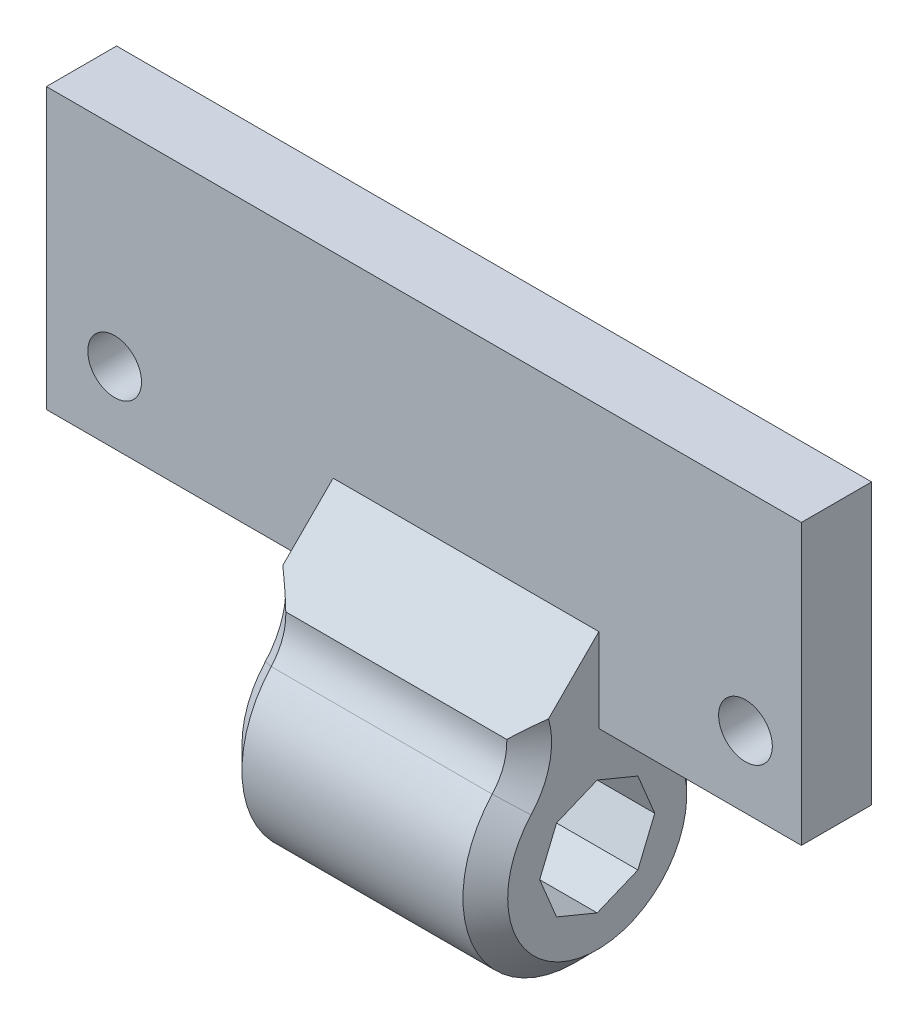
ISO-10303-21;
HEADER;
FILE_DESCRIPTION(('STEP AP214'),'2;1');
FILE_NAME('part.step','',(''),(''),'','','');
FILE_SCHEMA(('AUTOMOTIVE_DESIGN { 1 0 10303 214 1 1 1 1 }'));
ENDSEC;
DATA;
#1=APPLICATION_CONTEXT('core data for automotive mechanical design processes');
#2=APPLICATION_PROTOCOL_DEFINITION('international standard','automotive_design',2000,#1);
#3=PRODUCT_CONTEXT('',#1,'mechanical');
#4=PRODUCT('Part','Part','',(#3));
#5=PRODUCT_RELATED_PRODUCT_CATEGORY('part','',(#4));
#6=PRODUCT_DEFINITION_FORMATION('','',#4);
#7=PRODUCT_DEFINITION_CONTEXT('part definition',#1,'design');
#8=PRODUCT_DEFINITION('design','',#6,#7);
#9=PRODUCT_DEFINITION_SHAPE('','',#8);
#10=(LENGTH_UNIT() NAMED_UNIT(*) SI_UNIT(.MILLI.,.METRE.));
#11=(NAMED_UNIT(*) PLANE_ANGLE_UNIT() SI_UNIT($,.RADIAN.));
#12=(NAMED_UNIT(*) SI_UNIT($,.STERADIAN.) SOLID_ANGLE_UNIT());
#13=UNCERTAINTY_MEASURE_WITH_UNIT(LENGTH_MEASURE(1.E-05),#10,'distance_accuracy_value','');
#14=(GEOMETRIC_REPRESENTATION_CONTEXT(3) GLOBAL_UNCERTAINTY_ASSIGNED_CONTEXT((#13)) GLOBAL_UNIT_ASSIGNED_CONTEXT((#10,
#11,#12)) REPRESENTATION_CONTEXT('',''));
#15=CARTESIAN_POINT('',(0.,0.,0.));
#16=DIRECTION('',(0.,0.,1.));
#17=DIRECTION('',(1.,0.,0.));
#18=AXIS2_PLACEMENT_3D('',#15,#16,#17);
#19=CARTESIAN_POINT('',(10.25,0.423050926233683,7.));
#20=DIRECTION('',(1.,0.,0.));
#21=DIRECTION('',(0.,0.,-1.));
#22=AXIS2_PLACEMENT_3D('',#19,#20,#21);
#23=CYLINDRICAL_SURFACE('',#22,2.);
#24=CARTESIAN_POINT('',(18.95,0.423050926233683,7.));
#25=DIRECTION('',(-1.,0.,0.));
#26=DIRECTION('',(0.,0.,1.));
#27=AXIS2_PLACEMENT_3D('',#24,#25,#26);
#28=CIRCLE('',#27,2.);
#29=CARTESIAN_POINT('',(18.95,-0.925455628658212,5.52299963730079));
#30=VERTEX_POINT('',#29);
#31=CARTESIAN_POINT('',(18.95,0.507913909388373,5.0018012425962));
#32=VERTEX_POINT('',#31);
#33=EDGE_CURVE('E410',#30,#32,#28,.F.);
#34=ORIENTED_EDGE('',*,*,#33,.T.);
#35=DIRECTION('',(1.,0.,0.));
#36=VECTOR('',#35,1.);
#37=CARTESIAN_POINT('',(15.,0.507913909388373,5.0018012425962));
#38=LINE('',#37,#36);
#39=CARTESIAN_POINT('',(11.05,0.507913909388373,5.0018012425962));
#40=VERTEX_POINT('',#39);
#41=EDGE_CURVE('E472',#32,#40,#38,.F.);
#42=ORIENTED_EDGE('',*,*,#41,.T.);
#43=CARTESIAN_POINT('',(11.05,0.423050926233683,7.));
#44=DIRECTION('',(-1.,0.,0.));
#45=DIRECTION('',(0.,0.,1.));
#46=AXIS2_PLACEMENT_3D('',#43,#44,#45);
#47=CIRCLE('',#46,2.);
#48=CARTESIAN_POINT('',(11.05,-0.925455628658212,5.52299963730079));
#49=VERTEX_POINT('',#48);
#50=EDGE_CURVE('E406',#40,#49,#47,.T.);
#51=ORIENTED_EDGE('',*,*,#50,.T.);
#52=DIRECTION('',(1.,0.,0.));
#53=VECTOR('',#52,1.);
#54=CARTESIAN_POINT('',(10.25,-0.925455628658212,5.52299963730079));
#55=LINE('',#54,#53);
#56=EDGE_CURVE('E520',#30,#49,#55,.F.);
#57=ORIENTED_EDGE('',*,*,#56,.F.);
#58=EDGE_LOOP('',(#34,#42,#51,#57));
#59=FACE_BOUND('',#58,.T.);
#60=ADVANCED_FACE('F49',(#59),#23,.F.);
#61=CARTESIAN_POINT('',(19.75,0.423050926233683,7.));
#62=DIRECTION('',(1.,0.,0.));
#63=DIRECTION('',(0.,0.,-1.));
#64=AXIS2_PLACEMENT_3D('',#61,#62,#63);
#65=CONICAL_SURFACE('',#64,2.8,0.785398163397452);
#66=CARTESIAN_POINT('',(19.75,0.423050926233683,7.));
#67=DIRECTION('',(-1.,0.,0.));
#68=DIRECTION('',(0.,0.,1.));
#69=AXIS2_PLACEMENT_3D('',#66,#67,#68);
#70=CIRCLE('',#69,2.8);
#71=CARTESIAN_POINT('',(19.75,1.1998150550084,4.30990009697617));
#72=VERTEX_POINT('',#71);
#73=CARTESIAN_POINT('',(19.75,-1.46485825061497,4.93219949222111));
#74=VERTEX_POINT('',#73);
#75=EDGE_CURVE('E506',#72,#74,#70,.T.);
#76=ORIENTED_EDGE('',*,*,#75,.F.);
#77=CARTESIAN_POINT('',(19.75,1.1998150550084,4.30990009697616));
#78=CARTESIAN_POINT('',(19.6806154673853,1.14374842629069,4.36596672569388));
#79=CARTESIAN_POINT('',(19.6116339468195,1.0874267420899,4.42228840989467));
#80=CARTESIAN_POINT('',(19.4748806315207,0.974095147937252,4.53562000404732));
#81=CARTESIAN_POINT('',(19.4071083475537,0.917085532711202,4.59262961927337));
#82=CARTESIAN_POINT('',(19.2731057773733,0.802142415727973,4.7075727362566));
#83=CARTESIAN_POINT('',(19.2068758006592,0.744208732399213,4.76550641958536));
#84=CARTESIAN_POINT('',(19.109159564474,0.656381970195918,4.85333318178865));
#85=CARTESIAN_POINT('',(19.0768524222123,0.626945821190107,4.88276933079447));
#86=CARTESIAN_POINT('',(19.0129000208643,0.567713044482331,4.94200210750224));
#87=CARTESIAN_POINT('',(18.9812548112775,0.537916390082781,4.97179876190179));
#88=CARTESIAN_POINT('',(18.95,0.507913909388373,5.0018012425962));
#89=B_SPLINE_CURVE_WITH_KNOTS('',3,(#77,#78,#79,#80,#81,#82,#83,#84,#85,#86,#87,#88),
.UNSPECIFIED.,.F.,.F.,(4,2,2,2,2,4),(0.,0.316093225244113,0.63205552464532,0.948080692058834,
1.1061587284345,1.26424854397706),.UNSPECIFIED.);
#90=EDGE_CURVE('E270',#72,#32,#89,.T.);
#91=ORIENTED_EDGE('',*,*,#90,.T.);
#92=ORIENTED_EDGE('',*,*,#33,.F.);
#93=DIRECTION('',(-0.707106781186545,0.476769064719286,0.522198486139802));
#94=VECTOR('',#93,1.);
#95=CARTESIAN_POINT('',(19.75,-1.46485825061497,4.93219949222111));
#96=LINE('',#95,#94);
#97=EDGE_CURVE('E454',#74,#30,#96,.T.);
#98=ORIENTED_EDGE('',*,*,#97,.F.);
#99=EDGE_LOOP('',(#76,#91,#92,#98));
#100=FACE_BOUND('',#99,.T.);
#101=ADVANCED_FACE('F288',(#100),#65,.F.);
#102=CARTESIAN_POINT('',(10.25,0.423050926233683,7.));
#103=DIRECTION('',(-1.,0.,0.));
#104=DIRECTION('',(0.,0.,1.));
#105=AXIS2_PLACEMENT_3D('',#102,#103,#104);
#106=CONICAL_SURFACE('',#105,2.8,0.785398163397449);
#107=ORIENTED_EDGE('',*,*,#50,.F.);
#108=CARTESIAN_POINT('',(11.05,0.507913909388373,5.0018012425962));
#109=CARTESIAN_POINT('',(11.0187451887225,0.537916390082782,4.97179876190179));
#110=CARTESIAN_POINT('',(10.9870999791357,0.567713044482331,4.94200210750224));
#111=CARTESIAN_POINT('',(10.9231475777877,0.626945821190107,4.88276933079447));
#112=CARTESIAN_POINT('',(10.890840435526,0.656381970195918,4.85333318178865));
#113=CARTESIAN_POINT('',(10.7931241993408,0.744208732399213,4.76550641958536));
#114=CARTESIAN_POINT('',(10.7268942226267,0.802142415727973,4.7075727362566));
#115=CARTESIAN_POINT('',(10.5928916524463,0.917085532711204,4.59262961927337));
#116=CARTESIAN_POINT('',(10.5251193684793,0.974095147937253,4.53562000404732));
#117=CARTESIAN_POINT('',(10.3883660531805,1.0874267420899,4.42228840989466));
#118=CARTESIAN_POINT('',(10.3193845326147,1.14374842629069,4.36596672569388));
#119=CARTESIAN_POINT('',(10.25,1.19981505500841,4.30990009697616));
#120=B_SPLINE_CURVE_WITH_KNOTS('',3,(#108,#109,#110,#111,#112,#113,#114,#115,#116,#117,#118,
#119),.UNSPECIFIED.,.F.,.F.,(4,2,2,2,2,4),(0.,0.158089815542564,0.316167851918225,
0.632193019331742,0.948155318732951,1.26424854397707),.UNSPECIFIED.);
#121=CARTESIAN_POINT('',(10.25,1.1998150550084,4.30990009697616));
#122=VERTEX_POINT('',#121);
#123=EDGE_CURVE('E476',#40,#122,#120,.T.);
#124=ORIENTED_EDGE('',*,*,#123,.T.);
#125=CARTESIAN_POINT('',(10.25,0.423050926233683,7.));
#126=DIRECTION('',(-1.,0.,0.));
#127=DIRECTION('',(0.,0.,1.));
#128=AXIS2_PLACEMENT_3D('',#125,#126,#127);
#129=CIRCLE('',#128,2.8);
#130=CARTESIAN_POINT('',(10.25,-1.46485825061497,4.93219949222111));
#131=VERTEX_POINT('',#130);
#132=EDGE_CURVE('E426',#131,#122,#129,.F.);
#133=ORIENTED_EDGE('',*,*,#132,.F.);
#134=DIRECTION('',(-0.707106781186547,-0.476769064719284,-0.5221984861398));
#135=VECTOR('',#134,1.);
#136=CARTESIAN_POINT('',(11.05,-0.925455628658212,5.52299963730079));
#137=LINE('',#136,#135);
#138=EDGE_CURVE('E445',#49,#131,#137,.T.);
#139=ORIENTED_EDGE('',*,*,#138,.F.);
#140=EDGE_LOOP('',(#107,#124,#133,#139));
#141=FACE_BOUND('',#140,.T.);
#142=ADVANCED_FACE('F296',(#141),#106,.F.);
#143=CARTESIAN_POINT('',(0.,0.,5.));
#144=DIRECTION('',(0.,1.,0.));
#145=DIRECTION('',(0.,0.,1.));
#146=AXIS2_PLACEMENT_3D('',#143,#144,#145);
#147=PLANE('',#146);
#148=DIRECTION('',(0.,0.,-1.));
#149=VECTOR('',#148,1.);
#150=CARTESIAN_POINT('',(26.99,0.,5.));
#151=LINE('',#150,#149);
#152=CARTESIAN_POINT('',(26.99,0.,2.50971515198453));
#153=VERTEX_POINT('',#152);
#154=CARTESIAN_POINT('',(26.99,0.,0.));
#155=VERTEX_POINT('',#154);
#156=EDGE_CURVE('E526',#153,#155,#151,.T.);
#157=ORIENTED_EDGE('',*,*,#156,.F.);
#158=DIRECTION('',(-1.,0.,0.));
#159=VECTOR('',#158,1.);
#160=CARTESIAN_POINT('',(41.,0.,2.50971515198453));
#161=LINE('',#160,#159);
#162=CARTESIAN_POINT('',(19.75,0.,2.50971515198453));
#163=VERTEX_POINT('',#162);
#164=EDGE_CURVE('E461',#153,#163,#161,.T.);
#165=ORIENTED_EDGE('',*,*,#164,.T.);
#166=DIRECTION('',(0.,0.,1.));
#167=VECTOR('',#166,1.);
#168=CARTESIAN_POINT('',(19.75,0.,0.));
#169=LINE('',#168,#167);
#170=CARTESIAN_POINT('',(19.75,0.,0.787286498537847));
#171=VERTEX_POINT('',#170);
#172=EDGE_CURVE('E583',#171,#163,#169,.T.);
#173=ORIENTED_EDGE('',*,*,#172,.F.);
#174=CARTESIAN_POINT('',(19.75,0.,0.787286498537847));
#175=CARTESIAN_POINT('',(19.6194776927101,0.,0.656206935488565));
#176=CARTESIAN_POINT('',(19.4890232373199,0.,0.525059948604622));
#177=CARTESIAN_POINT('',(19.2282500190135,0.,0.262631115770385));
#178=CARTESIAN_POINT('',(19.0979312561092,0.,0.131349269808379));
#179=CARTESIAN_POINT('',(18.9676803451163,0.,0.));
#180=B_SPLINE_CURVE_WITH_KNOTS('',3,(#174,#175,#176,#177,#178,#179),.UNSPECIFIED.,.F.,.F.,(4,2,
4),(0.,0.554942405929778,1.10988486006077),.UNSPECIFIED.);
#181=CARTESIAN_POINT('',(18.9676803451163,0.,0.));
#182=VERTEX_POINT('',#181);
#183=EDGE_CURVE('E345',#171,#182,#180,.T.);
#184=ORIENTED_EDGE('',*,*,#183,.T.);
#185=DIRECTION('',(1.,0.,0.));
#186=VECTOR('',#185,1.);
#187=CARTESIAN_POINT('',(0.,0.,0.));
#188=LINE('',#187,#186);
#189=EDGE_CURVE('E546',#182,#155,#188,.T.);
#190=ORIENTED_EDGE('',*,*,#189,.T.);
#191=EDGE_LOOP('',(#157,#165,#173,#184,#190));
#192=FACE_BOUND('',#191,.T.);
#193=ADVANCED_FACE('F340',(#192),#147,.F.);
#194=CARTESIAN_POINT('',(0.,0.,0.));
#195=DIRECTION('',(0.,0.,-1.));
#196=DIRECTION('',(-1.,0.,0.));
#197=AXIS2_PLACEMENT_3D('',#194,#195,#196);
#198=PLANE('',#197);
#199=DIRECTION('',(0.,-1.,0.));
#200=VECTOR('',#199,1.);
#201=CARTESIAN_POINT('',(20.44,6.,0.));
#202=LINE('',#201,#200);
#203=CARTESIAN_POINT('',(20.44,6.,0.));
#204=VERTEX_POINT('',#203);
#205=CARTESIAN_POINT('',(20.44,1.43696554316181,0.));
#206=VERTEX_POINT('',#205);
#207=EDGE_CURVE('E247',#204,#206,#202,.T.);
#208=ORIENTED_EDGE('',*,*,#207,.F.);
#209=DIRECTION('',(1.,0.,0.));
#210=VECTOR('',#209,1.);
#211=CARTESIAN_POINT('',(20.44,6.,0.));
#212=LINE('',#211,#210);
#213=CARTESIAN_POINT('',(6.99,6.,0.));
#214=VERTEX_POINT('',#213);
#215=EDGE_CURVE('E237',#214,#204,#212,.T.);
#216=ORIENTED_EDGE('',*,*,#215,.F.);
#217=DIRECTION('',(0.,1.,0.));
#218=VECTOR('',#217,1.);
#219=CARTESIAN_POINT('',(6.99,6.,0.));
#220=LINE('',#219,#218);
#221=CARTESIAN_POINT('',(6.99,1.43696554316181,0.));
#222=VERTEX_POINT('',#221);
#223=EDGE_CURVE('E230',#222,#214,#220,.T.);
#224=ORIENTED_EDGE('',*,*,#223,.F.);
#225=DIRECTION('',(-1.,0.,0.));
#226=VECTOR('',#225,1.);
#227=CARTESIAN_POINT('',(20.44,1.43696554316181,0.));
#228=LINE('',#227,#226);
#229=EDGE_CURVE('E234',#206,#222,#228,.T.);
#230=ORIENTED_EDGE('',*,*,#229,.F.);
#231=EDGE_LOOP('',(#208,#216,#224,#230));
#232=FACE_BOUND('',#231,.T.);
#233=CARTESIAN_POINT('',(2.44,2.55,0.));
#234=DIRECTION('',(0.,0.,1.));
#235=DIRECTION('',(1.,0.,0.));
#236=AXIS2_PLACEMENT_3D('',#233,#234,#235);
#237=CIRCLE('',#236,0.960000000000001);
#238=CARTESIAN_POINT('',(3.4,2.55,0.));
#239=VERTEX_POINT('',#238);
#240=EDGE_CURVE('E551',#239,#239,#237,.T.);
#241=ORIENTED_EDGE('',*,*,#240,.T.);
#242=EDGE_LOOP('',(#241));
#243=FACE_BOUND('',#242,.T.);
#244=ORIENTED_EDGE('',*,*,#189,.F.);
#245=CARTESIAN_POINT('',(18.9676803451163,0.,0.));
#246=CARTESIAN_POINT('',(18.9618095819706,0.0442261466992125,0.));
#247=CARTESIAN_POINT('',(18.9574008383588,0.0885492800324076,0.));
#248=CARTESIAN_POINT('',(18.9515073620762,0.177389943962471,0.));
#249=CARTESIAN_POINT('',(18.9500226573159,0.221907476410847,0.));
#250=CARTESIAN_POINT('',(18.95,0.266521997344715,0.));
#251=B_SPLINE_CURVE_WITH_KNOTS('',3,(#245,#246,#247,#248,#249,#250),.UNSPECIFIED.,.F.,.F.,(4,2,
4),(0.,0.133625575839211,0.267252427151579),.UNSPECIFIED.);
#252=CARTESIAN_POINT('',(18.95,0.266521997344716,0.));
#253=VERTEX_POINT('',#252);
#254=EDGE_CURVE('E353',#182,#253,#251,.T.);
#255=ORIENTED_EDGE('',*,*,#254,.T.);
#256=DIRECTION('',(1.,0.,0.));
#257=VECTOR('',#256,1.);
#258=CARTESIAN_POINT('',(0.,0.266521997344716,0.));
#259=LINE('',#258,#257);
#260=CARTESIAN_POINT('',(11.05,0.266521997344716,0.));
#261=VERTEX_POINT('',#260);
#262=EDGE_CURVE('E387',#253,#261,#259,.F.);
#263=ORIENTED_EDGE('',*,*,#262,.T.);
#264=CARTESIAN_POINT('',(11.05,0.266521997344716,0.));
#265=CARTESIAN_POINT('',(11.0499773426841,0.221907476410848,0.));
#266=CARTESIAN_POINT('',(11.0484926379238,0.177389943962471,0.));
#267=CARTESIAN_POINT('',(11.0425991616412,0.0885492800324077,0.));
#268=CARTESIAN_POINT('',(11.0381904180295,0.0442261466992126,0.));
#269=CARTESIAN_POINT('',(11.0323196548837,0.,0.));
#270=B_SPLINE_CURVE_WITH_KNOTS('',3,(#264,#265,#266,#267,#268,#269),.UNSPECIFIED.,.F.,.F.,(4,2,
4),(0.,0.133626851312369,0.26725242715158),.UNSPECIFIED.);
#271=CARTESIAN_POINT('',(11.0323196548837,0.,0.));
#272=VERTEX_POINT('',#271);
#273=EDGE_CURVE('E313',#261,#272,#270,.T.);
#274=ORIENTED_EDGE('',*,*,#273,.T.);
#275=CARTESIAN_POINT('',(0.,0.,0.));
#276=VERTEX_POINT('',#275);
#277=EDGE_CURVE('E543',#276,#272,#188,.T.);
#278=ORIENTED_EDGE('',*,*,#277,.F.);
#279=DIRECTION('',(0.,-1.,0.));
#280=VECTOR('',#279,1.);
#281=CARTESIAN_POINT('',(0.,0.,0.));
#282=LINE('',#281,#280);
#283=CARTESIAN_POINT('',(0.,10.,0.));
#284=VERTEX_POINT('',#283);
#285=EDGE_CURVE('E547',#284,#276,#282,.T.);
#286=ORIENTED_EDGE('',*,*,#285,.F.);
#287=DIRECTION('',(-1.,0.,0.));
#288=VECTOR('',#287,1.);
#289=CARTESIAN_POINT('',(0.,10.,0.));
#290=LINE('',#289,#288);
#291=CARTESIAN_POINT('',(26.99,10.,0.));
#292=VERTEX_POINT('',#291);
#293=EDGE_CURVE('E535',#292,#284,#290,.T.);
#294=ORIENTED_EDGE('',*,*,#293,.F.);
#295=DIRECTION('',(0.,1.,0.));
#296=VECTOR('',#295,1.);
#297=CARTESIAN_POINT('',(26.99,10.,0.));
#298=LINE('',#297,#296);
#299=EDGE_CURVE('E539',#155,#292,#298,.T.);
#300=ORIENTED_EDGE('',*,*,#299,.F.);
#301=EDGE_LOOP('',(#244,#255,#263,#274,#278,#286,#294,#300));
#302=FACE_BOUND('',#301,.T.);
#303=CARTESIAN_POINT('',(24.99,2.55,0.));
#304=DIRECTION('',(0.,0.,1.));
#305=DIRECTION('',(1.,0.,0.));
#306=AXIS2_PLACEMENT_3D('',#303,#304,#305);
#307=CIRCLE('',#306,0.959999999999998);
#308=CARTESIAN_POINT('',(25.95,2.55,0.));
#309=VERTEX_POINT('',#308);
#310=EDGE_CURVE('E555',#309,#309,#307,.T.);
#311=ORIENTED_EDGE('',*,*,#310,.T.);
#312=EDGE_LOOP('',(#311));
#313=FACE_BOUND('',#312,.T.);
#314=ADVANCED_FACE('F232',(#232,#243,#302,#313),#198,.T.);
#315=CARTESIAN_POINT('',(0.,0.,5.));
#316=DIRECTION('',(1.,0.,0.));
#317=DIRECTION('',(0.,0.,-1.));
#318=AXIS2_PLACEMENT_3D('',#315,#316,#317);
#319=PLANE('',#318);
#320=DIRECTION('',(0.,0.,-1.));
#321=VECTOR('',#320,1.);
#322=CARTESIAN_POINT('',(0.,0.,5.));
#323=LINE('',#322,#321);
#324=CARTESIAN_POINT('',(0.,0.,2.50971515198453));
#325=VERTEX_POINT('',#324);
#326=EDGE_CURVE('E523',#325,#276,#323,.T.);
#327=ORIENTED_EDGE('',*,*,#326,.F.);
#328=DIRECTION('',(0.,-1.,0.));
#329=VECTOR('',#328,1.);
#330=CARTESIAN_POINT('',(0.,0.,2.50971515198453));
#331=LINE('',#330,#329);
#332=CARTESIAN_POINT('',(0.,10.,2.50971515198453));
#333=VERTEX_POINT('',#332);
#334=EDGE_CURVE('E665',#333,#325,#331,.T.);
#335=ORIENTED_EDGE('',*,*,#334,.F.);
#336=DIRECTION('',(0.,0.,-1.));
#337=VECTOR('',#336,1.);
#338=CARTESIAN_POINT('',(0.,10.,5.));
#339=LINE('',#338,#337);
#340=EDGE_CURVE('E532',#333,#284,#339,.T.);
#341=ORIENTED_EDGE('',*,*,#340,.T.);
#342=ORIENTED_EDGE('',*,*,#285,.T.);
#343=EDGE_LOOP('',(#327,#335,#341,#342));
#344=FACE_BOUND('',#343,.T.);
#345=ADVANCED_FACE('F338',(#344),#319,.F.);
#346=DIRECTION('',(0.,0.,1.));
#347=VECTOR('',#346,1.);
#348=CARTESIAN_POINT('',(10.25,0.,0.));
#349=LINE('',#348,#347);
#350=CARTESIAN_POINT('',(10.25,0.,0.787286498537852));
#351=VERTEX_POINT('',#350);
#352=CARTESIAN_POINT('',(10.25,0.,2.50971515198453));
#353=VERTEX_POINT('',#352);
#354=EDGE_CURVE('E438',#351,#353,#349,.T.);
#355=ORIENTED_EDGE('',*,*,#354,.T.);
#356=EDGE_CURVE('E658',#353,#325,#161,.T.);
#357=ORIENTED_EDGE('',*,*,#356,.T.);
#358=ORIENTED_EDGE('',*,*,#326,.T.);
#359=ORIENTED_EDGE('',*,*,#277,.T.);
#360=CARTESIAN_POINT('',(11.0323196548837,0.,0.));
#361=CARTESIAN_POINT('',(10.9020687438908,0.,0.131349269808381));
#362=CARTESIAN_POINT('',(10.7717499809865,0.,0.262631115770388));
#363=CARTESIAN_POINT('',(10.5109767626801,0.,0.525059948604626));
#364=CARTESIAN_POINT('',(10.3805223072899,0.,0.65620693548857));
#365=CARTESIAN_POINT('',(10.25,0.,0.787286498537852));
#366=B_SPLINE_CURVE_WITH_KNOTS('',3,(#360,#361,#362,#363,#364,#365),.UNSPECIFIED.,.F.,.F.,(4,2,
4),(0.,0.554942454131001,1.10988486006078),.UNSPECIFIED.);
#367=EDGE_CURVE('E321',#272,#351,#366,.T.);
#368=ORIENTED_EDGE('',*,*,#367,.T.);
#369=EDGE_LOOP('',(#355,#357,#358,#359,#368));
#370=FACE_BOUND('',#369,.T.);
#371=ADVANCED_FACE('F332',(#370),#147,.F.);
#372=CARTESIAN_POINT('',(26.99,10.,5.));
#373=DIRECTION('',(-1.,0.,0.));
#374=DIRECTION('',(0.,0.,1.));
#375=AXIS2_PLACEMENT_3D('',#372,#373,#374);
#376=PLANE('',#375);
#377=DIRECTION('',(0.,0.,-1.));
#378=VECTOR('',#377,1.);
#379=CARTESIAN_POINT('',(26.99,10.,5.));
#380=LINE('',#379,#378);
#381=CARTESIAN_POINT('',(26.99,10.,2.50971515198453));
#382=VERTEX_POINT('',#381);
#383=EDGE_CURVE('E529',#382,#292,#380,.T.);
#384=ORIENTED_EDGE('',*,*,#383,.F.);
#385=DIRECTION('',(0.,-1.,0.));
#386=VECTOR('',#385,1.);
#387=CARTESIAN_POINT('',(26.99,10.,2.50971515198453));
#388=LINE('',#387,#386);
#389=EDGE_CURVE('E446',#382,#153,#388,.T.);
#390=ORIENTED_EDGE('',*,*,#389,.T.);
#391=ORIENTED_EDGE('',*,*,#156,.T.);
#392=ORIENTED_EDGE('',*,*,#299,.T.);
#393=EDGE_LOOP('',(#384,#390,#391,#392));
#394=FACE_BOUND('',#393,.T.);
#395=ADVANCED_FACE('F337',(#394),#376,.F.);
#396=CARTESIAN_POINT('',(0.,10.,5.));
#397=DIRECTION('',(0.,-1.,0.));
#398=DIRECTION('',(0.,0.,-1.));
#399=AXIS2_PLACEMENT_3D('',#396,#397,#398);
#400=PLANE('',#399);
#401=ORIENTED_EDGE('',*,*,#340,.F.);
#402=DIRECTION('',(-1.,0.,0.));
#403=VECTOR('',#402,1.);
#404=CARTESIAN_POINT('',(41.,10.,2.50971515198453));
#405=LINE('',#404,#403);
#406=EDGE_CURVE('E662',#382,#333,#405,.T.);
#407=ORIENTED_EDGE('',*,*,#406,.F.);
#408=ORIENTED_EDGE('',*,*,#383,.T.);
#409=ORIENTED_EDGE('',*,*,#293,.T.);
#410=EDGE_LOOP('',(#401,#407,#408,#409));
#411=FACE_BOUND('',#410,.T.);
#412=ADVANCED_FACE('F728',(#411),#400,.F.);
#413=CARTESIAN_POINT('',(2.44,2.55,5.));
#414=DIRECTION('',(0.,0.,-1.));
#415=DIRECTION('',(-1.,0.,0.));
#416=AXIS2_PLACEMENT_3D('',#413,#414,#415);
#417=CYLINDRICAL_SURFACE('',#416,0.960000000000001);
#418=CARTESIAN_POINT('',(2.44,2.55,2.50971515198453));
#419=DIRECTION('',(0.,0.,-1.));
#420=DIRECTION('',(-1.,0.,0.));
#421=AXIS2_PLACEMENT_3D('',#418,#419,#420);
#422=CIRCLE('',#421,0.960000000000001);
#423=CARTESIAN_POINT('',(1.48,2.55,2.50971515198453));
#424=VERTEX_POINT('',#423);
#425=EDGE_CURVE('E460',#424,#424,#422,.T.);
#426=ORIENTED_EDGE('',*,*,#425,.F.);
#427=EDGE_LOOP('',(#426));
#428=FACE_BOUND('',#427,.T.);
#429=ORIENTED_EDGE('',*,*,#240,.F.);
#430=EDGE_LOOP('',(#429));
#431=FACE_BOUND('',#430,.T.);
#432=ADVANCED_FACE('F725',(#428,#431),#417,.F.);
#433=CARTESIAN_POINT('',(24.99,2.55,5.));
#434=DIRECTION('',(0.,0.,-1.));
#435=DIRECTION('',(-1.,0.,0.));
#436=AXIS2_PLACEMENT_3D('',#433,#434,#435);
#437=CYLINDRICAL_SURFACE('',#436,0.959999999999998);
#438=CARTESIAN_POINT('',(24.99,2.55,2.50971515198453));
#439=DIRECTION('',(0.,0.,-1.));
#440=DIRECTION('',(-1.,0.,0.));
#441=AXIS2_PLACEMENT_3D('',#438,#439,#440);
#442=CIRCLE('',#441,0.959999999999998);
#443=CARTESIAN_POINT('',(24.03,2.55,2.50971515198453));
#444=VERTEX_POINT('',#443);
#445=EDGE_CURVE('E456',#444,#444,#442,.T.);
#446=ORIENTED_EDGE('',*,*,#445,.F.);
#447=EDGE_LOOP('',(#446));
#448=FACE_BOUND('',#447,.T.);
#449=ORIENTED_EDGE('',*,*,#310,.F.);
#450=EDGE_LOOP('',(#449));
#451=FACE_BOUND('',#450,.T.);
#452=ADVANCED_FACE('F691',(#448,#451),#437,.F.);
#453=CARTESIAN_POINT('',(10.25,-3.622468738442,2.56899891190238));
#454=DIRECTION('',(1.,0.,0.));
#455=DIRECTION('',(0.,0.,-1.));
#456=AXIS2_PLACEMENT_3D('',#453,#454,#455);
#457=CYLINDRICAL_SURFACE('',#456,4.);
#458=DIRECTION('',(1.,0.,0.));
#459=VECTOR('',#458,1.);
#460=CARTESIAN_POINT('',(10.25,-1.02980824791752,-0.477000362699209));
#461=LINE('',#460,#459);
#462=CARTESIAN_POINT('',(11.05,-1.02980824791752,-0.477000362699209));
#463=VERTEX_POINT('',#462);
#464=CARTESIAN_POINT('',(18.95,-1.02980824791752,-0.477000362699209));
#465=VERTEX_POINT('',#464);
#466=EDGE_CURVE('E399',#463,#465,#461,.T.);
#467=ORIENTED_EDGE('',*,*,#466,.T.);
#468=CARTESIAN_POINT('',(18.95,-3.622468738442,2.56899891190238));
#469=DIRECTION('',(-1.,0.,0.));
#470=DIRECTION('',(0.,0.,1.));
#471=AXIS2_PLACEMENT_3D('',#468,#469,#470);
#472=CIRCLE('',#471,4.);
#473=EDGE_CURVE('E421',#465,#30,#472,.T.);
#474=ORIENTED_EDGE('',*,*,#473,.T.);
#475=ORIENTED_EDGE('',*,*,#56,.T.);
#476=CARTESIAN_POINT('',(11.05,-3.622468738442,2.56899891190238));
#477=DIRECTION('',(-1.,0.,0.));
#478=DIRECTION('',(0.,0.,1.));
#479=AXIS2_PLACEMENT_3D('',#476,#477,#478);
#480=CIRCLE('',#479,4.);
#481=EDGE_CURVE('E418',#49,#463,#480,.F.);
#482=ORIENTED_EDGE('',*,*,#481,.T.);
#483=EDGE_LOOP('',(#467,#474,#475,#482));
#484=FACE_BOUND('',#483,.T.);
#485=ADVANCED_FACE('F688',(#484),#457,.T.);
#486=CARTESIAN_POINT('',(10.25,-0.711678018666506,1.71814272470755));
#487=DIRECTION('',(0.,-0.382683432365079,0.923879532511291));
#488=DIRECTION('',(0.,-0.923879532511291,-0.382683432365079));
#489=AXIS2_PLACEMENT_3D('',#486,#487,#488);
#490=PLANE('',#489);
#491=DIRECTION('',(0.,-0.923879532511291,-0.382683432365079));
#492=VECTOR('',#491,1.);
#493=CARTESIAN_POINT('',(19.75,-0.711678018666506,1.71814272470755));
#494=LINE('',#493,#492);
#495=CARTESIAN_POINT('',(19.75,-2.16827169545468,1.11480186891502));
#496=VERTEX_POINT('',#495);
#497=CARTESIAN_POINT('',(19.75,-3.62246873844203,0.512453731346827));
#498=VERTEX_POINT('',#497);
#499=EDGE_CURVE('E615',#496,#498,#494,.T.);
#500=ORIENTED_EDGE('',*,*,#499,.F.);
#501=DIRECTION('',(1.,0.,0.));
#502=VECTOR('',#501,1.);
#503=CARTESIAN_POINT('',(10.25,-2.16827169545468,1.11480186891502));
#504=LINE('',#503,#502);
#505=CARTESIAN_POINT('',(10.25,-2.16827169545468,1.11480186891502));
#506=VERTEX_POINT('',#505);
#507=EDGE_CURVE('E559',#506,#496,#504,.T.);
#508=ORIENTED_EDGE('',*,*,#507,.F.);
#509=DIRECTION('',(0.,-0.923879532511291,-0.382683432365079));
#510=VECTOR('',#509,1.);
#511=CARTESIAN_POINT('',(10.25,-0.711678018666506,1.71814272470755));
#512=LINE('',#511,#510);
#513=CARTESIAN_POINT('',(10.25,-3.62246873844203,0.512453731346827));
#514=VERTEX_POINT('',#513);
#515=EDGE_CURVE('E586',#506,#514,#512,.T.);
#516=ORIENTED_EDGE('',*,*,#515,.T.);
#517=DIRECTION('',(1.,0.,0.));
#518=VECTOR('',#517,1.);
#519=CARTESIAN_POINT('',(10.25,-3.62246873844203,0.512453731346827));
#520=LINE('',#519,#518);
#521=EDGE_CURVE('E580',#514,#498,#520,.T.);
#522=ORIENTED_EDGE('',*,*,#521,.T.);
#523=EDGE_LOOP('',(#500,#508,#516,#522));
#524=FACE_BOUND('',#523,.T.);
#525=ADVANCED_FACE('F690',(#524),#490,.T.);
#526=CARTESIAN_POINT('',(10.25,-2.24487763797738,0.92985876351834));
#527=DIRECTION('',(0.,-0.923879532511282,0.3826834323651));
#528=DIRECTION('',(0.,-0.382683432365101,-0.923879532511282));
#529=AXIS2_PLACEMENT_3D('',#526,#527,#528);
#530=PLANE('',#529);
#531=DIRECTION('',(0.,-0.382683432365101,-0.923879532511282));
#532=VECTOR('',#531,1.);
#533=CARTESIAN_POINT('',(19.75,-2.24487763797738,0.92985876351834));
#534=LINE('',#533,#532);
#535=CARTESIAN_POINT('',(19.75,-1.56592355788645,2.56899891190235));
#536=VERTEX_POINT('',#535);
#537=EDGE_CURVE('E611',#536,#496,#534,.T.);
#538=ORIENTED_EDGE('',*,*,#537,.F.);
#539=DIRECTION('',(1.,0.,0.));
#540=VECTOR('',#539,1.);
#541=CARTESIAN_POINT('',(10.25,-1.56592355788645,2.56899891190235));
#542=LINE('',#541,#540);
#543=CARTESIAN_POINT('',(10.25,-1.56592355788645,2.56899891190235));
#544=VERTEX_POINT('',#543);
#545=EDGE_CURVE('E562',#544,#536,#542,.T.);
#546=ORIENTED_EDGE('',*,*,#545,.F.);
#547=DIRECTION('',(0.,-0.382683432365101,-0.923879532511282));
#548=VECTOR('',#547,1.);
#549=CARTESIAN_POINT('',(10.25,-2.24487763797738,0.92985876351834));
#550=LINE('',#549,#548);
#551=EDGE_CURVE('E645',#544,#506,#550,.T.);
#552=ORIENTED_EDGE('',*,*,#551,.T.);
#553=ORIENTED_EDGE('',*,*,#507,.T.);
#554=EDGE_LOOP('',(#538,#546,#552,#553));
#555=FACE_BOUND('',#554,.T.);
#556=ADVANCED_FACE('F715',(#555),#530,.T.);
#557=CARTESIAN_POINT('',(10.25,-0.428321086510391,-0.177416403082978));
#558=DIRECTION('',(0.,-0.923879532511291,-0.382683432365079));
#559=DIRECTION('',(0.,0.382683432365079,-0.923879532511291));
#560=AXIS2_PLACEMENT_3D('',#557,#558,#559);
#561=PLANE('',#560);
#562=DIRECTION('',(0.,0.382683432365079,-0.923879532511291));
#563=VECTOR('',#562,1.);
#564=CARTESIAN_POINT('',(19.75,-0.428321086510391,-0.177416403082978));
#565=LINE('',#564,#563);
#566=CARTESIAN_POINT('',(19.75,-2.16827169545464,4.0231959548897));
#567=VERTEX_POINT('',#566);
#568=EDGE_CURVE('E607',#567,#536,#565,.T.);
#569=ORIENTED_EDGE('',*,*,#568,.F.);
#570=DIRECTION('',(1.,0.,0.));
#571=VECTOR('',#570,1.);
#572=CARTESIAN_POINT('',(10.25,-2.16827169545464,4.0231959548897));
#573=LINE('',#572,#571);
#574=CARTESIAN_POINT('',(10.25,-2.16827169545464,4.0231959548897));
#575=VERTEX_POINT('',#574);
#576=EDGE_CURVE('E565',#575,#567,#573,.T.);
#577=ORIENTED_EDGE('',*,*,#576,.F.);
#578=DIRECTION('',(0.,0.382683432365079,-0.923879532511291));
#579=VECTOR('',#578,1.);
#580=CARTESIAN_POINT('',(10.25,-0.428321086510391,-0.177416403082978));
#581=LINE('',#580,#579);
#582=EDGE_CURVE('E641',#575,#544,#581,.T.);
#583=ORIENTED_EDGE('',*,*,#582,.T.);
#584=ORIENTED_EDGE('',*,*,#545,.T.);
#585=EDGE_LOOP('',(#569,#577,#583,#584));
#586=FACE_BOUND('',#585,.T.);
#587=ADVANCED_FACE('F711',(#586),#561,.T.);
#588=CARTESIAN_POINT('',(10.25,1.10487853280051,2.66741273866178));
#589=DIRECTION('',(0.,-0.382683432365101,-0.923879532511282));
#590=DIRECTION('',(0.,0.923879532511282,-0.382683432365101));
#591=AXIS2_PLACEMENT_3D('',#588,#589,#590);
#592=PLANE('',#591);
#593=DIRECTION('',(0.,0.923879532511282,-0.382683432365101));
#594=VECTOR('',#593,1.);
#595=CARTESIAN_POINT('',(19.75,1.10487853280051,2.66741273866178));
#596=LINE('',#595,#594);
#597=CARTESIAN_POINT('',(19.75,-3.62246873844198,4.62554409245792));
#598=VERTEX_POINT('',#597);
#599=EDGE_CURVE('E603',#598,#567,#596,.T.);
#600=ORIENTED_EDGE('',*,*,#599,.F.);
#601=DIRECTION('',(1.,0.,0.));
#602=VECTOR('',#601,1.);
#603=CARTESIAN_POINT('',(10.25,-3.62246873844198,4.62554409245792));
#604=LINE('',#603,#602);
#605=CARTESIAN_POINT('',(10.25,-3.62246873844198,4.62554409245792));
#606=VERTEX_POINT('',#605);
#607=EDGE_CURVE('E568',#606,#598,#604,.T.);
#608=ORIENTED_EDGE('',*,*,#607,.F.);
#609=DIRECTION('',(0.,0.923879532511282,-0.382683432365101));
#610=VECTOR('',#609,1.);
#611=CARTESIAN_POINT('',(10.25,1.10487853280051,2.66741273866178));
#612=LINE('',#611,#610);
#613=EDGE_CURVE('E637',#606,#575,#612,.T.);
#614=ORIENTED_EDGE('',*,*,#613,.T.);
#615=ORIENTED_EDGE('',*,*,#576,.T.);
#616=EDGE_LOOP('',(#600,#608,#614,#615));
#617=FACE_BOUND('',#616,.T.);
#618=ADVANCED_FACE('F707',(#617),#592,.T.);
#619=CARTESIAN_POINT('',(10.25,-2.16587506165381,5.22888494825046));
#620=DIRECTION('',(0.,0.382683432365079,-0.923879532511291));
#621=DIRECTION('',(0.,0.923879532511291,0.382683432365079));
#622=AXIS2_PLACEMENT_3D('',#619,#620,#621);
#623=PLANE('',#622);
#624=DIRECTION('',(0.,0.923879532511291,0.382683432365079));
#625=VECTOR('',#624,1.);
#626=CARTESIAN_POINT('',(19.75,-2.16587506165381,5.22888494825046));
#627=LINE('',#626,#625);
#628=CARTESIAN_POINT('',(19.75,-5.07666578142932,4.02319595488973));
#629=VERTEX_POINT('',#628);
#630=EDGE_CURVE('E599',#629,#598,#627,.T.);
#631=ORIENTED_EDGE('',*,*,#630,.F.);
#632=DIRECTION('',(1.,0.,0.));
#633=VECTOR('',#632,1.);
#634=CARTESIAN_POINT('',(10.25,-5.07666578142932,4.02319595488973));
#635=LINE('',#634,#633);
#636=CARTESIAN_POINT('',(10.25,-5.07666578142932,4.02319595488973));
#637=VERTEX_POINT('',#636);
#638=EDGE_CURVE('E571',#637,#629,#635,.T.);
#639=ORIENTED_EDGE('',*,*,#638,.F.);
#640=DIRECTION('',(0.,0.923879532511291,0.382683432365079));
#641=VECTOR('',#640,1.);
#642=CARTESIAN_POINT('',(10.25,-2.16587506165381,5.22888494825046));
#643=LINE('',#642,#641);
#644=EDGE_CURVE('E633',#637,#606,#643,.T.);
#645=ORIENTED_EDGE('',*,*,#644,.T.);
#646=ORIENTED_EDGE('',*,*,#607,.T.);
#647=EDGE_LOOP('',(#631,#639,#645,#646));
#648=FACE_BOUND('',#647,.T.);
#649=ADVANCED_FACE('F703',(#648),#623,.T.);
#650=CARTESIAN_POINT('',(10.25,-5.75561986152025,2.38405580650572));
#651=DIRECTION('',(0.,0.923879532511282,-0.3826834323651));
#652=DIRECTION('',(0.,0.382683432365101,0.923879532511282));
#653=AXIS2_PLACEMENT_3D('',#650,#651,#652);
#654=PLANE('',#653);
#655=DIRECTION('',(0.,0.382683432365101,0.923879532511282));
#656=VECTOR('',#655,1.);
#657=CARTESIAN_POINT('',(19.75,-5.75561986152025,2.38405580650572));
#658=LINE('',#657,#656);
#659=CARTESIAN_POINT('',(19.75,-5.67901391899755,2.5689989119024));
#660=VERTEX_POINT('',#659);
#661=EDGE_CURVE('E595',#660,#629,#658,.T.);
#662=ORIENTED_EDGE('',*,*,#661,.F.);
#663=DIRECTION('',(1.,0.,0.));
#664=VECTOR('',#663,1.);
#665=CARTESIAN_POINT('',(10.25,-5.67901391899755,2.5689989119024));
#666=LINE('',#665,#664);
#667=CARTESIAN_POINT('',(10.25,-5.67901391899755,2.5689989119024));
#668=VERTEX_POINT('',#667);
#669=EDGE_CURVE('E574',#668,#660,#666,.T.);
#670=ORIENTED_EDGE('',*,*,#669,.F.);
#671=DIRECTION('',(0.,0.382683432365101,0.923879532511282));
#672=VECTOR('',#671,1.);
#673=CARTESIAN_POINT('',(10.25,-5.75561986152025,2.38405580650572));
#674=LINE('',#673,#672);
#675=EDGE_CURVE('E629',#668,#637,#674,.T.);
#676=ORIENTED_EDGE('',*,*,#675,.T.);
#677=ORIENTED_EDGE('',*,*,#638,.T.);
#678=EDGE_LOOP('',(#662,#670,#676,#677));
#679=FACE_BOUND('',#678,.T.);
#680=ADVANCED_FACE('F699',(#679),#654,.T.);
#681=CARTESIAN_POINT('',(10.25,-3.9390633100533,-1.63161344607028));
#682=DIRECTION('',(0.,0.923879532511291,0.382683432365079));
#683=DIRECTION('',(0.,-0.382683432365079,0.923879532511291));
#684=AXIS2_PLACEMENT_3D('',#681,#682,#683);
#685=PLANE('',#684);
#686=DIRECTION('',(0.,-0.382683432365079,0.923879532511291));
#687=VECTOR('',#686,1.);
#688=CARTESIAN_POINT('',(19.75,-3.9390633100533,-1.63161344607028));
#689=LINE('',#688,#687);
#690=CARTESIAN_POINT('',(19.75,-5.07666578142936,1.11480186891505));
#691=VERTEX_POINT('',#690);
#692=EDGE_CURVE('E591',#691,#660,#689,.T.);
#693=ORIENTED_EDGE('',*,*,#692,.F.);
#694=DIRECTION('',(1.,0.,0.));
#695=VECTOR('',#694,1.);
#696=CARTESIAN_POINT('',(10.25,-5.07666578142936,1.11480186891505));
#697=LINE('',#696,#695);
#698=CARTESIAN_POINT('',(10.25,-5.07666578142936,1.11480186891505));
#699=VERTEX_POINT('',#698);
#700=EDGE_CURVE('E577',#699,#691,#697,.T.);
#701=ORIENTED_EDGE('',*,*,#700,.F.);
#702=DIRECTION('',(0.,-0.382683432365079,0.923879532511291));
#703=VECTOR('',#702,1.);
#704=CARTESIAN_POINT('',(10.25,-3.9390633100533,-1.63161344607028));
#705=LINE('',#704,#703);
#706=EDGE_CURVE('E625',#699,#668,#705,.T.);
#707=ORIENTED_EDGE('',*,*,#706,.T.);
#708=ORIENTED_EDGE('',*,*,#669,.T.);
#709=EDGE_LOOP('',(#693,#701,#707,#708));
#710=FACE_BOUND('',#709,.T.);
#711=ADVANCED_FACE('F695',(#710),#685,.T.);
#712=CARTESIAN_POINT('',(10.25,-0.349318510186876,-0.843329484881092));
#713=DIRECTION('',(0.,0.3826834323651,0.923879532511282));
#714=DIRECTION('',(0.,-0.923879532511282,0.3826834323651));
#715=AXIS2_PLACEMENT_3D('',#712,#713,#714);
#716=PLANE('',#715);
#717=DIRECTION('',(0.,-0.923879532511282,0.3826834323651));
#718=VECTOR('',#717,1.);
#719=CARTESIAN_POINT('',(19.75,-0.349318510186876,-0.843329484881092));
#720=LINE('',#719,#718);
#721=EDGE_CURVE('E587',#498,#691,#720,.T.);
#722=ORIENTED_EDGE('',*,*,#721,.F.);
#723=ORIENTED_EDGE('',*,*,#521,.F.);
#724=DIRECTION('',(0.,-0.923879532511282,0.3826834323651));
#725=VECTOR('',#724,1.);
#726=CARTESIAN_POINT('',(10.25,-0.349318510186876,-0.843329484881092));
#727=LINE('',#726,#725);
#728=EDGE_CURVE('E621',#514,#699,#727,.T.);
#729=ORIENTED_EDGE('',*,*,#728,.T.);
#730=ORIENTED_EDGE('',*,*,#700,.T.);
#731=EDGE_LOOP('',(#722,#723,#729,#730));
#732=FACE_BOUND('',#731,.T.);
#733=ADVANCED_FACE('F686',(#732),#716,.T.);
#734=CARTESIAN_POINT('',(10.25,0.,0.));
#735=DIRECTION('',(-1.,0.,0.));
#736=DIRECTION('',(0.,0.,1.));
#737=AXIS2_PLACEMENT_3D('',#734,#735,#736);
#738=PLANE('',#737);
#739=ORIENTED_EDGE('',*,*,#354,.F.);
#740=CARTESIAN_POINT('',(10.25,0.266521997344716,-2.));
#741=DIRECTION('',(-1.,0.,0.));
#742=DIRECTION('',(0.,0.,1.));
#743=AXIS2_PLACEMENT_3D('',#740,#741,#742);
#744=CIRCLE('',#743,2.8);
#745=CARTESIAN_POINT('',(10.25,-1.54834034602242,0.132199492221109));
#746=VERTEX_POINT('',#745);
#747=EDGE_CURVE('E354',#351,#746,#744,.F.);
#748=ORIENTED_EDGE('',*,*,#747,.T.);
#749=CARTESIAN_POINT('',(10.25,-3.622468738442,2.56899891190238));
#750=DIRECTION('',(-1.,0.,0.));
#751=DIRECTION('',(0.,0.,1.));
#752=AXIS2_PLACEMENT_3D('',#749,#750,#751);
#753=CIRCLE('',#752,3.2);
#754=EDGE_CURVE('E424',#746,#131,#753,.T.);
#755=ORIENTED_EDGE('',*,*,#754,.T.);
#756=ORIENTED_EDGE('',*,*,#132,.T.);
#757=DIRECTION('',(0.,0.707106781186544,-0.707106781186551));
#758=VECTOR('',#757,1.);
#759=CARTESIAN_POINT('',(10.25,0.,5.50971515198458));
#760=LINE('',#759,#758);
#761=CARTESIAN_POINT('',(10.25,3.00000000000002,2.50971515198453));
#762=VERTEX_POINT('',#761);
#763=EDGE_CURVE('E482',#122,#762,#760,.T.);
#764=ORIENTED_EDGE('',*,*,#763,.T.);
#765=DIRECTION('',(0.,1.,0.));
#766=VECTOR('',#765,1.);
#767=CARTESIAN_POINT('',(10.25,0.,2.50971515198453));
#768=LINE('',#767,#766);
#769=EDGE_CURVE('E468',#353,#762,#768,.T.);
#770=ORIENTED_EDGE('',*,*,#769,.F.);
#771=EDGE_LOOP('',(#739,#748,#755,#756,#764,#770));
#772=FACE_BOUND('',#771,.T.);
#773=ORIENTED_EDGE('',*,*,#515,.F.);
#774=ORIENTED_EDGE('',*,*,#551,.F.);
#775=ORIENTED_EDGE('',*,*,#582,.F.);
#776=ORIENTED_EDGE('',*,*,#613,.F.);
#777=ORIENTED_EDGE('',*,*,#644,.F.);
#778=ORIENTED_EDGE('',*,*,#675,.F.);
#779=ORIENTED_EDGE('',*,*,#706,.F.);
#780=ORIENTED_EDGE('',*,*,#728,.F.);
#781=EDGE_LOOP('',(#773,#774,#775,#776,#777,#778,#779,#780));
#782=FACE_BOUND('',#781,.T.);
#783=ADVANCED_FACE('F382',(#772,#782),#738,.T.);
#784=CARTESIAN_POINT('',(19.75,0.,0.));
#785=DIRECTION('',(-1.,0.,0.));
#786=DIRECTION('',(0.,0.,1.));
#787=AXIS2_PLACEMENT_3D('',#784,#785,#786);
#788=PLANE('',#787);
#789=ORIENTED_EDGE('',*,*,#499,.T.);
#790=ORIENTED_EDGE('',*,*,#721,.T.);
#791=ORIENTED_EDGE('',*,*,#692,.T.);
#792=ORIENTED_EDGE('',*,*,#661,.T.);
#793=ORIENTED_EDGE('',*,*,#630,.T.);
#794=ORIENTED_EDGE('',*,*,#599,.T.);
#795=ORIENTED_EDGE('',*,*,#568,.T.);
#796=ORIENTED_EDGE('',*,*,#537,.T.);
#797=EDGE_LOOP('',(#789,#790,#791,#792,#793,#794,#795,#796));
#798=FACE_BOUND('',#797,.T.);
#799=CARTESIAN_POINT('',(19.75,-3.622468738442,2.56899891190238));
#800=DIRECTION('',(-1.,0.,0.));
#801=DIRECTION('',(0.,0.,1.));
#802=AXIS2_PLACEMENT_3D('',#799,#800,#801);
#803=CIRCLE('',#802,3.2);
#804=CARTESIAN_POINT('',(19.75,-1.54834034602242,0.132199492221106));
#805=VERTEX_POINT('',#804);
#806=EDGE_CURVE('E398',#74,#805,#803,.F.);
#807=ORIENTED_EDGE('',*,*,#806,.T.);
#808=CARTESIAN_POINT('',(19.75,0.266521997344716,-2.));
#809=DIRECTION('',(-1.,0.,0.));
#810=DIRECTION('',(0.,0.,1.));
#811=AXIS2_PLACEMENT_3D('',#808,#809,#810);
#812=CIRCLE('',#811,2.8);
#813=EDGE_CURVE('E412',#805,#171,#812,.T.);
#814=ORIENTED_EDGE('',*,*,#813,.T.);
#815=ORIENTED_EDGE('',*,*,#172,.T.);
#816=DIRECTION('',(0.,-1.,0.));
#817=VECTOR('',#816,1.);
#818=CARTESIAN_POINT('',(19.75,0.,2.50971515198453));
#819=LINE('',#818,#817);
#820=CARTESIAN_POINT('',(19.75,3.00000000000002,2.50971515198453));
#821=VERTEX_POINT('',#820);
#822=EDGE_CURVE('E329',#821,#163,#819,.T.);
#823=ORIENTED_EDGE('',*,*,#822,.F.);
#824=DIRECTION('',(0.,-0.707106781186544,0.707106781186551));
#825=VECTOR('',#824,1.);
#826=CARTESIAN_POINT('',(19.75,2.75485757599229,2.75485757599226));
#827=LINE('',#826,#825);
#828=EDGE_CURVE('E280',#821,#72,#827,.T.);
#829=ORIENTED_EDGE('',*,*,#828,.T.);
#830=ORIENTED_EDGE('',*,*,#75,.T.);
#831=EDGE_LOOP('',(#807,#814,#815,#823,#829,#830));
#832=FACE_BOUND('',#831,.T.);
#833=ADVANCED_FACE('F374',(#798,#832),#788,.F.);
#834=CARTESIAN_POINT('',(10.25,0.266521997344716,-2.));
#835=DIRECTION('',(1.,0.,0.));
#836=DIRECTION('',(0.,0.,-1.));
#837=AXIS2_PLACEMENT_3D('',#834,#835,#836);
#838=CYLINDRICAL_SURFACE('',#837,2.);
#839=ORIENTED_EDGE('',*,*,#262,.F.);
#840=CARTESIAN_POINT('',(18.95,0.266521997344716,-2.));
#841=DIRECTION('',(-1.,0.,0.));
#842=DIRECTION('',(0.,0.,1.));
#843=AXIS2_PLACEMENT_3D('',#840,#841,#842);
#844=CIRCLE('',#843,2.);
#845=EDGE_CURVE('E390',#253,#465,#844,.F.);
#846=ORIENTED_EDGE('',*,*,#845,.T.);
#847=ORIENTED_EDGE('',*,*,#466,.F.);
#848=CARTESIAN_POINT('',(11.05,0.266521997344716,-2.));
#849=DIRECTION('',(-1.,0.,0.));
#850=DIRECTION('',(0.,0.,1.));
#851=AXIS2_PLACEMENT_3D('',#848,#849,#850);
#852=CIRCLE('',#851,2.);
#853=EDGE_CURVE('E393',#463,#261,#852,.T.);
#854=ORIENTED_EDGE('',*,*,#853,.T.);
#855=EDGE_LOOP('',(#839,#846,#847,#854));
#856=FACE_BOUND('',#855,.T.);
#857=ADVANCED_FACE('F372',(#856),#838,.F.);
#858=CARTESIAN_POINT('',(18.95,-3.622468738442,2.56899891190238));
#859=DIRECTION('',(-1.,0.,0.));
#860=DIRECTION('',(0.,0.,1.));
#861=AXIS2_PLACEMENT_3D('',#858,#859,#860);
#862=CONICAL_SURFACE('',#861,4.,0.785398163397452);
#863=ORIENTED_EDGE('',*,*,#97,.T.);
#864=ORIENTED_EDGE('',*,*,#473,.F.);
#865=DIRECTION('',(-0.707106781186545,0.458321953541076,-0.538461685640023));
#866=VECTOR('',#865,1.);
#867=CARTESIAN_POINT('',(19.75,-1.54834034602242,0.132199492221106));
#868=LINE('',#867,#866);
#869=EDGE_CURVE('E330',#805,#465,#868,.T.);
#870=ORIENTED_EDGE('',*,*,#869,.F.);
#871=ORIENTED_EDGE('',*,*,#806,.F.);
#872=EDGE_LOOP('',(#863,#864,#870,#871));
#873=FACE_BOUND('',#872,.T.);
#874=ADVANCED_FACE('F298',(#873),#862,.T.);
#875=CARTESIAN_POINT('',(19.75,0.266521997344716,-2.));
#876=DIRECTION('',(1.,0.,0.));
#877=DIRECTION('',(0.,0.,-1.));
#878=AXIS2_PLACEMENT_3D('',#875,#876,#877);
#879=CONICAL_SURFACE('',#878,2.8,0.785398163397452);
#880=ORIENTED_EDGE('',*,*,#869,.T.);
#881=ORIENTED_EDGE('',*,*,#845,.F.);
#882=ORIENTED_EDGE('',*,*,#254,.F.);
#883=ORIENTED_EDGE('',*,*,#183,.F.);
#884=ORIENTED_EDGE('',*,*,#813,.F.);
#885=EDGE_LOOP('',(#880,#881,#882,#883,#884));
#886=FACE_BOUND('',#885,.T.);
#887=ADVANCED_FACE('F361',(#886),#879,.F.);
#888=CARTESIAN_POINT('',(10.25,-3.622468738442,2.56899891190238));
#889=DIRECTION('',(1.,0.,0.));
#890=DIRECTION('',(0.,0.,-1.));
#891=AXIS2_PLACEMENT_3D('',#888,#889,#890);
#892=CONICAL_SURFACE('',#891,3.2,0.785398163397449);
#893=ORIENTED_EDGE('',*,*,#138,.T.);
#894=ORIENTED_EDGE('',*,*,#754,.F.);
#895=DIRECTION('',(-0.707106781186547,-0.458321953541075,0.538461685640021));
#896=VECTOR('',#895,1.);
#897=CARTESIAN_POINT('',(11.05,-1.02980824791752,-0.477000362699209));
#898=LINE('',#897,#896);
#899=EDGE_CURVE('E441',#463,#746,#898,.T.);
#900=ORIENTED_EDGE('',*,*,#899,.F.);
#901=ORIENTED_EDGE('',*,*,#481,.F.);
#902=EDGE_LOOP('',(#893,#894,#900,#901));
#903=FACE_BOUND('',#902,.T.);
#904=ADVANCED_FACE('F309',(#903),#892,.T.);
#905=CARTESIAN_POINT('',(10.25,0.266521997344716,-2.));
#906=DIRECTION('',(-1.,0.,0.));
#907=DIRECTION('',(0.,0.,1.));
#908=AXIS2_PLACEMENT_3D('',#905,#906,#907);
#909=CONICAL_SURFACE('',#908,2.8,0.78539816339745);
#910=ORIENTED_EDGE('',*,*,#273,.F.);
#911=ORIENTED_EDGE('',*,*,#853,.F.);
#912=ORIENTED_EDGE('',*,*,#899,.T.);
#913=ORIENTED_EDGE('',*,*,#747,.F.);
#914=ORIENTED_EDGE('',*,*,#367,.F.);
#915=EDGE_LOOP('',(#910,#911,#912,#913,#914));
#916=FACE_BOUND('',#915,.T.);
#917=ADVANCED_FACE('F301',(#916),#909,.F.);
#918=CARTESIAN_POINT('',(41.,0.,2.50971515198453));
#919=DIRECTION('',(0.,0.,-1.));
#920=DIRECTION('',(-1.,0.,0.));
#921=AXIS2_PLACEMENT_3D('',#918,#919,#920);
#922=PLANE('',#921);
#923=ORIENTED_EDGE('',*,*,#425,.T.);
#924=EDGE_LOOP('',(#923));
#925=FACE_BOUND('',#924,.T.);
#926=ORIENTED_EDGE('',*,*,#445,.T.);
#927=EDGE_LOOP('',(#926));
#928=FACE_BOUND('',#927,.T.);
#929=ORIENTED_EDGE('',*,*,#356,.F.);
#930=ORIENTED_EDGE('',*,*,#769,.T.);
#931=DIRECTION('',(1.,0.,0.));
#932=VECTOR('',#931,1.);
#933=CARTESIAN_POINT('',(41.,3.00000000000002,2.50971515198453));
#934=LINE('',#933,#932);
#935=EDGE_CURVE('E464',#762,#821,#934,.T.);
#936=ORIENTED_EDGE('',*,*,#935,.T.);
#937=ORIENTED_EDGE('',*,*,#822,.T.);
#938=ORIENTED_EDGE('',*,*,#164,.F.);
#939=ORIENTED_EDGE('',*,*,#389,.F.);
#940=ORIENTED_EDGE('',*,*,#406,.T.);
#941=ORIENTED_EDGE('',*,*,#334,.T.);
#942=EDGE_LOOP('',(#929,#930,#936,#937,#938,#939,#940,#941));
#943=FACE_BOUND('',#942,.T.);
#944=ADVANCED_FACE('F308',(#925,#928,#943),#922,.F.);
#945=CARTESIAN_POINT('',(41.,0.,5.50971515198458));
#946=DIRECTION('',(0.,-0.707106781186551,-0.707106781186544));
#947=DIRECTION('',(-1.,0.,0.));
#948=AXIS2_PLACEMENT_3D('',#945,#946,#947);
#949=PLANE('',#948);
#950=ORIENTED_EDGE('',*,*,#828,.F.);
#951=ORIENTED_EDGE('',*,*,#935,.F.);
#952=ORIENTED_EDGE('',*,*,#763,.F.);
#953=ORIENTED_EDGE('',*,*,#123,.F.);
#954=ORIENTED_EDGE('',*,*,#41,.F.);
#955=ORIENTED_EDGE('',*,*,#90,.F.);
#956=EDGE_LOOP('',(#950,#951,#952,#953,#954,#955));
#957=FACE_BOUND('',#956,.T.);
#958=ADVANCED_FACE('F283',(#957),#949,.F.);
#959=CARTESIAN_POINT('',(0.,0.,1.));
#960=DIRECTION('',(0.,0.,-1.));
#961=DIRECTION('',(-1.,0.,0.));
#962=AXIS2_PLACEMENT_3D('',#959,#960,#961);
#963=PLANE('',#962);
#964=DIRECTION('',(0.,1.,0.));
#965=VECTOR('',#964,1.);
#966=CARTESIAN_POINT('',(7.99000000000001,0.,1.));
#967=LINE('',#966,#965);
#968=CARTESIAN_POINT('',(7.99000000000001,2.43696554316182,1.));
#969=VERTEX_POINT('',#968);
#970=CARTESIAN_POINT('',(7.99000000000001,5.,1.));
#971=VERTEX_POINT('',#970);
#972=EDGE_CURVE('E60',#969,#971,#967,.T.);
#973=ORIENTED_EDGE('',*,*,#972,.T.);
#974=DIRECTION('',(1.,0.,0.));
#975=VECTOR('',#974,1.);
#976=CARTESIAN_POINT('',(0.,5.,1.));
#977=LINE('',#976,#975);
#978=CARTESIAN_POINT('',(19.44,5.,1.));
#979=VERTEX_POINT('',#978);
#980=EDGE_CURVE('E11',#971,#979,#977,.T.);
#981=ORIENTED_EDGE('',*,*,#980,.T.);
#982=DIRECTION('',(0.,-1.,0.));
#983=VECTOR('',#982,1.);
#984=CARTESIAN_POINT('',(19.44,0.,1.));
#985=LINE('',#984,#983);
#986=CARTESIAN_POINT('',(19.44,2.43696554316182,1.));
#987=VERTEX_POINT('',#986);
#988=EDGE_CURVE('E267',#979,#987,#985,.T.);
#989=ORIENTED_EDGE('',*,*,#988,.T.);
#990=DIRECTION('',(-1.,0.,0.));
#991=VECTOR('',#990,1.);
#992=CARTESIAN_POINT('',(0.,2.43696554316182,1.));
#993=LINE('',#992,#991);
#994=EDGE_CURVE('E71',#987,#969,#993,.T.);
#995=ORIENTED_EDGE('',*,*,#994,.T.);
#996=EDGE_LOOP('',(#973,#981,#989,#995));
#997=FACE_BOUND('',#996,.T.);
#998=ADVANCED_FACE('F674',(#997),#963,.T.);
#999=CARTESIAN_POINT('',(0.,2.43696554316182,1.));
#1000=DIRECTION('',(0.,-0.707106781186545,0.70710678118655));
#1001=DIRECTION('',(-1.,0.,0.));
#1002=AXIS2_PLACEMENT_3D('',#999,#1000,#1001);
#1003=PLANE('',#1002);
#1004=DIRECTION('',(-0.577350269189627,0.577350269189627,0.577350269189624));
#1005=VECTOR('',#1004,1.);
#1006=CARTESIAN_POINT('',(12.96,8.91696554316184,7.47999999999998));
#1007=LINE('',#1006,#1005);
#1008=EDGE_CURVE('E244',#206,#987,#1007,.T.);
#1009=ORIENTED_EDGE('',*,*,#1008,.F.);
#1010=ORIENTED_EDGE('',*,*,#229,.T.);
#1011=DIRECTION('',(0.577350269189627,0.577350269189627,0.577350269189623));
#1012=VECTOR('',#1011,1.);
#1013=CARTESIAN_POINT('',(7.1776781522794,1.62464369544121,0.187678152279396));
#1014=LINE('',#1013,#1012);
#1015=EDGE_CURVE('E54',#969,#222,#1014,.F.);
#1016=ORIENTED_EDGE('',*,*,#1015,.F.);
#1017=ORIENTED_EDGE('',*,*,#994,.F.);
#1018=EDGE_LOOP('',(#1009,#1010,#1016,#1017));
#1019=FACE_BOUND('',#1018,.T.);
#1020=ADVANCED_FACE('F52',(#1019),#1003,.F.);
#1021=CARTESIAN_POINT('',(7.99000000000001,0.,1.));
#1022=DIRECTION('',(-0.707106781186545,0.,0.70710678118655));
#1023=DIRECTION('',(0.,1.,0.));
#1024=AXIS2_PLACEMENT_3D('',#1021,#1022,#1023);
#1025=PLANE('',#1024);
#1026=ORIENTED_EDGE('',*,*,#1015,.T.);
#1027=ORIENTED_EDGE('',*,*,#223,.T.);
#1028=DIRECTION('',(0.577350269189627,-0.577350269189627,0.577350269189623));
#1029=VECTOR('',#1028,1.);
#1030=CARTESIAN_POINT('',(5.32666666666666,7.66333333333334,-1.66333333333333));
#1031=LINE('',#1030,#1029);
#1032=EDGE_CURVE('E254',#971,#214,#1031,.F.);
#1033=ORIENTED_EDGE('',*,*,#1032,.F.);
#1034=ORIENTED_EDGE('',*,*,#972,.F.);
#1035=EDGE_LOOP('',(#1026,#1027,#1033,#1034));
#1036=FACE_BOUND('',#1035,.T.);
#1037=ADVANCED_FACE('F249',(#1036),#1025,.F.);
#1038=CARTESIAN_POINT('',(19.44,0.,1.));
#1039=DIRECTION('',(0.707106781186545,0.,0.70710678118655));
#1040=DIRECTION('',(0.,-1.,0.));
#1041=AXIS2_PLACEMENT_3D('',#1038,#1039,#1040);
#1042=PLANE('',#1041);
#1043=ORIENTED_EDGE('',*,*,#1008,.T.);
#1044=ORIENTED_EDGE('',*,*,#988,.F.);
#1045=DIRECTION('',(0.577350269189627,0.577350269189627,-0.577350269189623));
#1046=VECTOR('',#1045,1.);
#1047=CARTESIAN_POINT('',(12.96,-1.48000000000003,7.47999999999998));
#1048=LINE('',#1047,#1046);
#1049=EDGE_CURVE('E258',#204,#979,#1048,.F.);
#1050=ORIENTED_EDGE('',*,*,#1049,.F.);
#1051=ORIENTED_EDGE('',*,*,#207,.T.);
#1052=EDGE_LOOP('',(#1043,#1044,#1050,#1051));
#1053=FACE_BOUND('',#1052,.T.);
#1054=ADVANCED_FACE('F673',(#1053),#1042,.F.);
#1055=CARTESIAN_POINT('',(0.,5.,1.));
#1056=DIRECTION('',(0.,0.707106781186545,0.70710678118655));
#1057=DIRECTION('',(1.,0.,0.));
#1058=AXIS2_PLACEMENT_3D('',#1055,#1056,#1057);
#1059=PLANE('',#1058);
#1060=ORIENTED_EDGE('',*,*,#1032,.T.);
#1061=ORIENTED_EDGE('',*,*,#215,.T.);
#1062=ORIENTED_EDGE('',*,*,#1049,.T.);
#1063=ORIENTED_EDGE('',*,*,#980,.F.);
#1064=EDGE_LOOP('',(#1060,#1061,#1062,#1063));
#1065=FACE_BOUND('',#1064,.T.);
#1066=ADVANCED_FACE('F671',(#1065),#1059,.F.);
#1067=CLOSED_SHELL('',(#60,#101,#142,#193,#314,#345,#371,#395,#412,#432,#452,#485,#525,#556,
#587,#618,#649,#680,#711,#733,#783,#833,#857,#874,#887,#904,#917,#944,#958,#998,#1020,#1037,
#1054,#1066));
#1068=MANIFOLD_SOLID_BREP('B2',#1067);
#1069=ADVANCED_BREP_SHAPE_REPRESENTATION('',(#18,#1068),#14);
#1070=SHAPE_DEFINITION_REPRESENTATION(#9,#1069);
ENDSEC;
END-ISO-10303-21;
